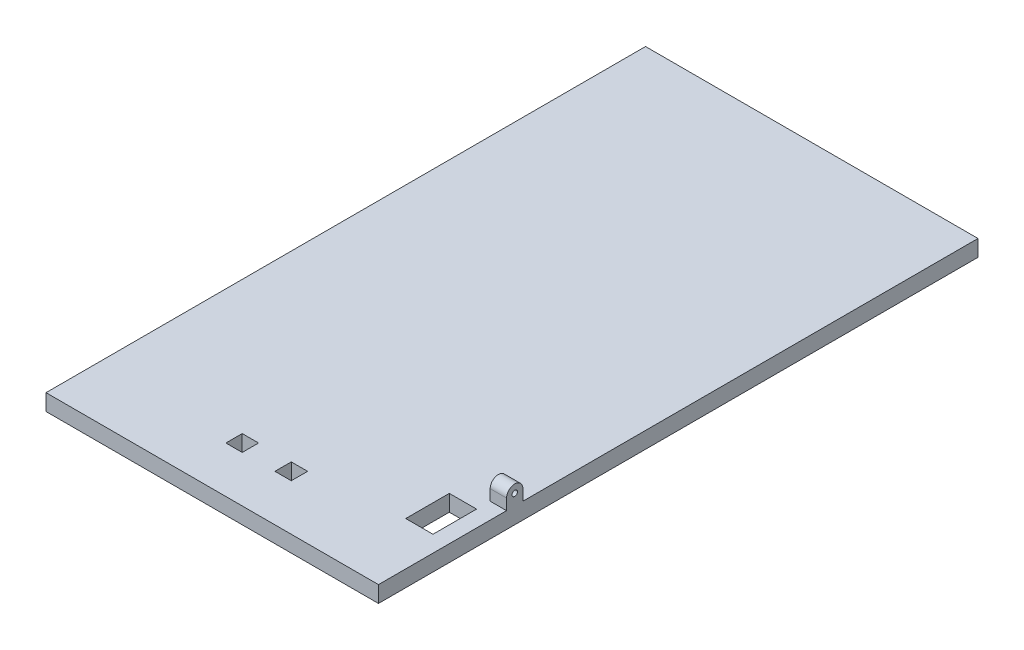
ISO-10303-21;
HEADER;
FILE_DESCRIPTION(('STEP AP214'),'2;1');
FILE_NAME('part.step','',(''),(''),'','','');
FILE_SCHEMA(('AUTOMOTIVE_DESIGN { 1 0 10303 214 1 1 1 1 }'));
ENDSEC;
DATA;
#1=APPLICATION_CONTEXT('core data for automotive mechanical design processes');
#2=APPLICATION_PROTOCOL_DEFINITION('international standard','automotive_design',2000,#1);
#3=PRODUCT_CONTEXT('',#1,'mechanical');
#4=PRODUCT('Part','Part','',(#3));
#5=PRODUCT_RELATED_PRODUCT_CATEGORY('part','',(#4));
#6=PRODUCT_DEFINITION_FORMATION('','',#4);
#7=PRODUCT_DEFINITION_CONTEXT('part definition',#1,'design');
#8=PRODUCT_DEFINITION('design','',#6,#7);
#9=PRODUCT_DEFINITION_SHAPE('','',#8);
#10=(LENGTH_UNIT() NAMED_UNIT(*) SI_UNIT(.MILLI.,.METRE.));
#11=(NAMED_UNIT(*) PLANE_ANGLE_UNIT() SI_UNIT($,.RADIAN.));
#12=(NAMED_UNIT(*) SI_UNIT($,.STERADIAN.) SOLID_ANGLE_UNIT());
#13=UNCERTAINTY_MEASURE_WITH_UNIT(LENGTH_MEASURE(1.E-05),#10,'distance_accuracy_value','');
#14=(GEOMETRIC_REPRESENTATION_CONTEXT(3) GLOBAL_UNCERTAINTY_ASSIGNED_CONTEXT((#13)) GLOBAL_UNIT_ASSIGNED_CONTEXT((#10,
#11,#12)) REPRESENTATION_CONTEXT('',''));
#15=CARTESIAN_POINT('',(0.,0.,0.));
#16=DIRECTION('',(0.,0.,1.));
#17=DIRECTION('',(1.,0.,0.));
#18=AXIS2_PLACEMENT_3D('',#15,#16,#17);
#19=CARTESIAN_POINT('',(0.,3.,0.));
#20=DIRECTION('',(0.,-1.,0.));
#21=DIRECTION('',(0.,0.,-1.));
#22=AXIS2_PLACEMENT_3D('',#19,#20,#21);
#23=PLANE('',#22);
#24=DIRECTION('',(0.,0.,1.));
#25=VECTOR('',#24,1.);
#26=CARTESIAN_POINT('',(27.5,3.,1.5));
#27=LINE('',#26,#25);
#28=CARTESIAN_POINT('',(27.5,3.,-1.5));
#29=VERTEX_POINT('',#28);
#30=CARTESIAN_POINT('',(27.5,3.,1.5));
#31=VERTEX_POINT('',#30);
#32=EDGE_CURVE('E198',#29,#31,#27,.T.);
#33=ORIENTED_EDGE('',*,*,#32,.T.);
#34=DIRECTION('',(-1.,0.,0.));
#35=VECTOR('',#34,1.);
#36=CARTESIAN_POINT('',(24.5,3.,1.5));
#37=LINE('',#36,#35);
#38=CARTESIAN_POINT('',(24.5,3.,1.5));
#39=VERTEX_POINT('',#38);
#40=EDGE_CURVE('E190',#31,#39,#37,.T.);
#41=ORIENTED_EDGE('',*,*,#40,.T.);
#42=DIRECTION('',(0.,0.,-1.));
#43=VECTOR('',#42,1.);
#44=CARTESIAN_POINT('',(24.5,3.,1.5));
#45=LINE('',#44,#43);
#46=CARTESIAN_POINT('',(24.5,3.,-1.5));
#47=VERTEX_POINT('',#46);
#48=EDGE_CURVE('E201',#39,#47,#45,.T.);
#49=ORIENTED_EDGE('',*,*,#48,.T.);
#50=DIRECTION('',(1.,0.,0.));
#51=VECTOR('',#50,1.);
#52=CARTESIAN_POINT('',(24.5,3.,-1.5));
#53=LINE('',#52,#51);
#54=EDGE_CURVE('E52',#47,#29,#53,.T.);
#55=ORIENTED_EDGE('',*,*,#54,.T.);
#56=EDGE_LOOP('',(#33,#41,#49,#55));
#57=FACE_BOUND('',#56,.T.);
#58=DIRECTION('',(1.,0.,0.));
#59=VECTOR('',#58,1.);
#60=CARTESIAN_POINT('',(36.5,3.,-1.5));
#61=LINE('',#60,#59);
#62=CARTESIAN_POINT('',(33.5,3.,-1.5));
#63=VERTEX_POINT('',#62);
#64=CARTESIAN_POINT('',(36.5,3.,-1.5));
#65=VERTEX_POINT('',#64);
#66=EDGE_CURVE('E232',#63,#65,#61,.T.);
#67=ORIENTED_EDGE('',*,*,#66,.T.);
#68=DIRECTION('',(0.,0.,1.));
#69=VECTOR('',#68,1.);
#70=CARTESIAN_POINT('',(36.5,3.,1.5));
#71=LINE('',#70,#69);
#72=CARTESIAN_POINT('',(36.5,3.,1.5));
#73=VERTEX_POINT('',#72);
#74=EDGE_CURVE('E224',#65,#73,#71,.T.);
#75=ORIENTED_EDGE('',*,*,#74,.T.);
#76=DIRECTION('',(-1.,0.,0.));
#77=VECTOR('',#76,1.);
#78=CARTESIAN_POINT('',(36.5,3.,1.5));
#79=LINE('',#78,#77);
#80=CARTESIAN_POINT('',(33.5,3.,1.5));
#81=VERTEX_POINT('',#80);
#82=EDGE_CURVE('E227',#73,#81,#79,.T.);
#83=ORIENTED_EDGE('',*,*,#82,.T.);
#84=DIRECTION('',(0.,0.,-1.));
#85=VECTOR('',#84,1.);
#86=CARTESIAN_POINT('',(33.5,3.,1.5));
#87=LINE('',#86,#85);
#88=EDGE_CURVE('E60',#81,#63,#87,.T.);
#89=ORIENTED_EDGE('',*,*,#88,.T.);
#90=EDGE_LOOP('',(#67,#75,#83,#89));
#91=FACE_BOUND('',#90,.T.);
#92=DIRECTION('',(-1.,0.,0.));
#93=VECTOR('',#92,1.);
#94=CARTESIAN_POINT('',(58.,3.,-11.));
#95=LINE('',#94,#93);
#96=CARTESIAN_POINT('',(58.,3.,-11.));
#97=VERTEX_POINT('',#96);
#98=CARTESIAN_POINT('',(53.,3.,-11.));
#99=VERTEX_POINT('',#98);
#100=EDGE_CURVE('E597',#97,#99,#95,.T.);
#101=ORIENTED_EDGE('',*,*,#100,.F.);
#102=DIRECTION('',(0.,0.,-1.));
#103=VECTOR('',#102,1.);
#104=CARTESIAN_POINT('',(58.,3.,-3.));
#105=LINE('',#104,#103);
#106=CARTESIAN_POINT('',(58.,3.,-3.));
#107=VERTEX_POINT('',#106);
#108=EDGE_CURVE('E595',#107,#97,#105,.T.);
#109=ORIENTED_EDGE('',*,*,#108,.F.);
#110=DIRECTION('',(1.,0.,0.));
#111=VECTOR('',#110,1.);
#112=CARTESIAN_POINT('',(58.,3.,-3.));
#113=LINE('',#112,#111);
#114=CARTESIAN_POINT('',(53.,3.,-3.));
#115=VERTEX_POINT('',#114);
#116=EDGE_CURVE('E606',#115,#107,#113,.T.);
#117=ORIENTED_EDGE('',*,*,#116,.F.);
#118=DIRECTION('',(0.,0.,1.));
#119=VECTOR('',#118,1.);
#120=CARTESIAN_POINT('',(53.,3.,-3.));
#121=LINE('',#120,#119);
#122=EDGE_CURVE('E603',#99,#115,#121,.T.);
#123=ORIENTED_EDGE('',*,*,#122,.F.);
#124=EDGE_LOOP('',(#101,#109,#117,#123));
#125=FACE_BOUND('',#124,.T.);
#126=DIRECTION('',(1.,0.,0.));
#127=VECTOR('',#126,1.);
#128=CARTESIAN_POINT('',(58.,3.,-13.5));
#129=LINE('',#128,#127);
#130=CARTESIAN_POINT('',(58.,3.,-13.5));
#131=VERTEX_POINT('',#130);
#132=CARTESIAN_POINT('',(61.,3.,-13.5));
#133=VERTEX_POINT('',#132);
#134=EDGE_CURVE('E270',#131,#133,#129,.T.);
#135=ORIENTED_EDGE('',*,*,#134,.F.);
#136=DIRECTION('',(0.,0.,-1.));
#137=VECTOR('',#136,1.);
#138=CARTESIAN_POINT('',(58.,3.,-13.5));
#139=LINE('',#138,#137);
#140=CARTESIAN_POINT('',(58.,3.,-16.5));
#141=VERTEX_POINT('',#140);
#142=EDGE_CURVE('E260',#131,#141,#139,.T.);
#143=ORIENTED_EDGE('',*,*,#142,.T.);
#144=DIRECTION('',(1.,0.,0.));
#145=VECTOR('',#144,1.);
#146=CARTESIAN_POINT('',(58.,3.,-16.5));
#147=LINE('',#146,#145);
#148=CARTESIAN_POINT('',(61.,3.,-16.5));
#149=VERTEX_POINT('',#148);
#150=EDGE_CURVE('E279',#141,#149,#147,.T.);
#151=ORIENTED_EDGE('',*,*,#150,.T.);
#152=DIRECTION('',(0.,0.,-1.));
#153=VECTOR('',#152,1.);
#154=CARTESIAN_POINT('',(61.,3.,0.));
#155=LINE('',#154,#153);
#156=CARTESIAN_POINT('',(61.,3.,-100.));
#157=VERTEX_POINT('',#156);
#158=EDGE_CURVE('E299',#149,#157,#155,.T.);
#159=ORIENTED_EDGE('',*,*,#158,.T.);
#160=DIRECTION('',(-1.,0.,0.));
#161=VECTOR('',#160,1.);
#162=CARTESIAN_POINT('',(0.,3.,-100.));
#163=LINE('',#162,#161);
#164=CARTESIAN_POINT('',(0.,3.,-100.));
#165=VERTEX_POINT('',#164);
#166=EDGE_CURVE('E308',#157,#165,#163,.T.);
#167=ORIENTED_EDGE('',*,*,#166,.T.);
#168=DIRECTION('',(0.,0.,1.));
#169=VECTOR('',#168,1.);
#170=CARTESIAN_POINT('',(0.,3.,0.));
#171=LINE('',#170,#169);
#172=CARTESIAN_POINT('',(0.,3.,10.));
#173=VERTEX_POINT('',#172);
#174=EDGE_CURVE('E303',#165,#173,#171,.T.);
#175=ORIENTED_EDGE('',*,*,#174,.T.);
#176=DIRECTION('',(-1.,0.,0.));
#177=VECTOR('',#176,1.);
#178=CARTESIAN_POINT('',(0.,3.,10.));
#179=LINE('',#178,#177);
#180=CARTESIAN_POINT('',(61.,3.,10.));
#181=VERTEX_POINT('',#180);
#182=EDGE_CURVE('E348',#181,#173,#179,.T.);
#183=ORIENTED_EDGE('',*,*,#182,.F.);
#184=EDGE_CURVE('E302',#181,#133,#155,.T.);
#185=ORIENTED_EDGE('',*,*,#184,.T.);
#186=EDGE_LOOP('',(#135,#143,#151,#159,#167,#175,#183,#185));
#187=FACE_BOUND('',#186,.T.);
#188=ADVANCED_FACE('F35',(#57,#91,#125,#187),#23,.F.);
#189=CARTESIAN_POINT('',(21.5,0.,0.));
#190=DIRECTION('',(1.,0.,0.));
#191=DIRECTION('',(0.,0.,-1.));
#192=AXIS2_PLACEMENT_3D('',#189,#190,#191);
#193=CYLINDRICAL_SURFACE('',#192,1.5);
#194=CARTESIAN_POINT('',(24.5,0.,0.));
#195=DIRECTION('',(1.,0.,0.));
#196=DIRECTION('',(0.,0.,-1.));
#197=AXIS2_PLACEMENT_3D('',#194,#195,#196);
#198=CIRCLE('',#197,1.5);
#199=CARTESIAN_POINT('',(24.5,0.,1.5));
#200=VERTEX_POINT('',#199);
#201=CARTESIAN_POINT('',(24.5,0.,-1.5));
#202=VERTEX_POINT('',#201);
#203=EDGE_CURVE('E354',#200,#202,#198,.T.);
#204=ORIENTED_EDGE('',*,*,#203,.F.);
#205=DIRECTION('',(1.,0.,0.));
#206=VECTOR('',#205,1.);
#207=CARTESIAN_POINT('',(21.5,0.,1.5));
#208=LINE('',#207,#206);
#209=CARTESIAN_POINT('',(21.5,0.,1.5));
#210=VERTEX_POINT('',#209);
#211=EDGE_CURVE('E347',#200,#210,#208,.F.);
#212=ORIENTED_EDGE('',*,*,#211,.T.);
#213=CARTESIAN_POINT('',(21.5,0.,0.));
#214=DIRECTION('',(1.,0.,0.));
#215=DIRECTION('',(0.,0.,-1.));
#216=AXIS2_PLACEMENT_3D('',#213,#214,#215);
#217=CIRCLE('',#216,1.5);
#218=CARTESIAN_POINT('',(21.5,0.,-1.5));
#219=VERTEX_POINT('',#218);
#220=EDGE_CURVE('E315',#210,#219,#217,.T.);
#221=ORIENTED_EDGE('',*,*,#220,.T.);
#222=DIRECTION('',(1.,0.,0.));
#223=VECTOR('',#222,1.);
#224=CARTESIAN_POINT('',(21.5,0.,-1.5));
#225=LINE('',#224,#223);
#226=EDGE_CURVE('E324',#219,#202,#225,.T.);
#227=ORIENTED_EDGE('',*,*,#226,.T.);
#228=EDGE_LOOP('',(#204,#212,#221,#227));
#229=FACE_BOUND('',#228,.T.);
#230=ADVANCED_FACE('F363',(#229),#193,.T.);
#231=CARTESIAN_POINT('',(21.5,0.,0.));
#232=DIRECTION('',(1.,0.,0.));
#233=DIRECTION('',(0.,0.,-1.));
#234=AXIS2_PLACEMENT_3D('',#231,#232,#233);
#235=PLANE('',#234);
#236=ORIENTED_EDGE('',*,*,#220,.F.);
#237=DIRECTION('',(0.,0.,1.));
#238=VECTOR('',#237,1.);
#239=CARTESIAN_POINT('',(21.5,0.,0.));
#240=LINE('',#239,#238);
#241=EDGE_CURVE('E327',#219,#210,#240,.T.);
#242=ORIENTED_EDGE('',*,*,#241,.F.);
#243=EDGE_LOOP('',(#236,#242));
#244=FACE_BOUND('',#243,.T.);
#245=ADVANCED_FACE('F370',(#244),#235,.F.);
#246=CARTESIAN_POINT('',(24.5,0.,0.));
#247=DIRECTION('',(1.,0.,0.));
#248=DIRECTION('',(0.,0.,-1.));
#249=AXIS2_PLACEMENT_3D('',#246,#247,#248);
#250=PLANE('',#249);
#251=ORIENTED_EDGE('',*,*,#203,.T.);
#252=DIRECTION('',(0.,-1.,0.));
#253=VECTOR('',#252,1.);
#254=CARTESIAN_POINT('',(24.5,3.,-1.5));
#255=LINE('',#254,#253);
#256=EDGE_CURVE('E197',#47,#202,#255,.T.);
#257=ORIENTED_EDGE('',*,*,#256,.F.);
#258=ORIENTED_EDGE('',*,*,#48,.F.);
#259=DIRECTION('',(0.,-1.,0.));
#260=VECTOR('',#259,1.);
#261=CARTESIAN_POINT('',(24.5,3.,1.5));
#262=LINE('',#261,#260);
#263=EDGE_CURVE('E186',#39,#200,#262,.T.);
#264=ORIENTED_EDGE('',*,*,#263,.T.);
#265=EDGE_LOOP('',(#251,#257,#258,#264));
#266=FACE_BOUND('',#265,.T.);
#267=ADVANCED_FACE('F202',(#266),#250,.T.);
#268=CARTESIAN_POINT('',(36.5,0.,0.));
#269=DIRECTION('',(1.,0.,0.));
#270=DIRECTION('',(0.,0.,-1.));
#271=AXIS2_PLACEMENT_3D('',#268,#269,#270);
#272=CYLINDRICAL_SURFACE('',#271,1.5);
#273=CARTESIAN_POINT('',(39.5,0.,0.));
#274=DIRECTION('',(1.,0.,0.));
#275=DIRECTION('',(0.,0.,-1.));
#276=AXIS2_PLACEMENT_3D('',#273,#274,#275);
#277=CIRCLE('',#276,1.5);
#278=CARTESIAN_POINT('',(39.5,0.,1.5));
#279=VERTEX_POINT('',#278);
#280=CARTESIAN_POINT('',(39.5,0.,-1.5));
#281=VERTEX_POINT('',#280);
#282=EDGE_CURVE('E334',#279,#281,#277,.T.);
#283=ORIENTED_EDGE('',*,*,#282,.F.);
#284=DIRECTION('',(1.,0.,0.));
#285=VECTOR('',#284,1.);
#286=CARTESIAN_POINT('',(36.5,0.,1.5));
#287=LINE('',#286,#285);
#288=CARTESIAN_POINT('',(36.5,0.,1.5));
#289=VERTEX_POINT('',#288);
#290=EDGE_CURVE('E339',#279,#289,#287,.F.);
#291=ORIENTED_EDGE('',*,*,#290,.T.);
#292=CARTESIAN_POINT('',(36.5,0.,0.));
#293=DIRECTION('',(1.,0.,0.));
#294=DIRECTION('',(0.,0.,-1.));
#295=AXIS2_PLACEMENT_3D('',#292,#293,#294);
#296=CIRCLE('',#295,1.5);
#297=CARTESIAN_POINT('',(36.5,0.,-1.5));
#298=VERTEX_POINT('',#297);
#299=EDGE_CURVE('E351',#289,#298,#296,.T.);
#300=ORIENTED_EDGE('',*,*,#299,.T.);
#301=DIRECTION('',(1.,0.,0.));
#302=VECTOR('',#301,1.);
#303=CARTESIAN_POINT('',(36.5,0.,-1.5));
#304=LINE('',#303,#302);
#305=EDGE_CURVE('E11',#298,#281,#304,.T.);
#306=ORIENTED_EDGE('',*,*,#305,.T.);
#307=EDGE_LOOP('',(#283,#291,#300,#306));
#308=FACE_BOUND('',#307,.T.);
#309=ADVANCED_FACE('F350',(#308),#272,.T.);
#310=CARTESIAN_POINT('',(36.5,0.,0.));
#311=DIRECTION('',(1.,0.,0.));
#312=DIRECTION('',(0.,0.,-1.));
#313=AXIS2_PLACEMENT_3D('',#310,#311,#312);
#314=PLANE('',#313);
#315=ORIENTED_EDGE('',*,*,#299,.F.);
#316=DIRECTION('',(0.,-1.,0.));
#317=VECTOR('',#316,1.);
#318=CARTESIAN_POINT('',(36.5,3.,1.5));
#319=LINE('',#318,#317);
#320=EDGE_CURVE('E235',#73,#289,#319,.T.);
#321=ORIENTED_EDGE('',*,*,#320,.F.);
#322=ORIENTED_EDGE('',*,*,#74,.F.);
#323=DIRECTION('',(0.,-1.,0.));
#324=VECTOR('',#323,1.);
#325=CARTESIAN_POINT('',(36.5,3.,-1.5));
#326=LINE('',#325,#324);
#327=EDGE_CURVE('E243',#65,#298,#326,.T.);
#328=ORIENTED_EDGE('',*,*,#327,.T.);
#329=EDGE_LOOP('',(#315,#321,#322,#328));
#330=FACE_BOUND('',#329,.T.);
#331=ADVANCED_FACE('F453',(#330),#314,.F.);
#332=CARTESIAN_POINT('',(39.5,0.,0.));
#333=DIRECTION('',(1.,0.,0.));
#334=DIRECTION('',(0.,0.,-1.));
#335=AXIS2_PLACEMENT_3D('',#332,#333,#334);
#336=PLANE('',#335);
#337=DIRECTION('',(0.,0.,1.));
#338=VECTOR('',#337,1.);
#339=CARTESIAN_POINT('',(39.5,0.,0.));
#340=LINE('',#339,#338);
#341=EDGE_CURVE('E44',#281,#279,#340,.T.);
#342=ORIENTED_EDGE('',*,*,#341,.T.);
#343=ORIENTED_EDGE('',*,*,#282,.T.);
#344=EDGE_LOOP('',(#342,#343));
#345=FACE_BOUND('',#344,.T.);
#346=ADVANCED_FACE('F332',(#345),#336,.T.);
#347=CARTESIAN_POINT('',(0.,0.,0.));
#348=DIRECTION('',(0.,-1.,0.));
#349=DIRECTION('',(0.,0.,-1.));
#350=AXIS2_PLACEMENT_3D('',#347,#348,#349);
#351=PLANE('',#350);
#352=DIRECTION('',(-1.,0.,0.));
#353=VECTOR('',#352,1.);
#354=CARTESIAN_POINT('',(24.5,0.,1.5));
#355=LINE('',#354,#353);
#356=CARTESIAN_POINT('',(27.5,0.,1.5));
#357=VERTEX_POINT('',#356);
#358=EDGE_CURVE('E193',#357,#200,#355,.T.);
#359=ORIENTED_EDGE('',*,*,#358,.F.);
#360=DIRECTION('',(0.,0.,1.));
#361=VECTOR('',#360,1.);
#362=CARTESIAN_POINT('',(27.5,0.,1.5));
#363=LINE('',#362,#361);
#364=CARTESIAN_POINT('',(27.5,0.,-1.5));
#365=VERTEX_POINT('',#364);
#366=EDGE_CURVE('E207',#365,#357,#363,.T.);
#367=ORIENTED_EDGE('',*,*,#366,.F.);
#368=DIRECTION('',(1.,0.,0.));
#369=VECTOR('',#368,1.);
#370=CARTESIAN_POINT('',(24.5,0.,-1.5));
#371=LINE('',#370,#369);
#372=EDGE_CURVE('E210',#202,#365,#371,.T.);
#373=ORIENTED_EDGE('',*,*,#372,.F.);
#374=ORIENTED_EDGE('',*,*,#226,.F.);
#375=ORIENTED_EDGE('',*,*,#241,.T.);
#376=ORIENTED_EDGE('',*,*,#211,.F.);
#377=EDGE_LOOP('',(#359,#367,#373,#374,#375,#376));
#378=FACE_BOUND('',#377,.T.);
#379=DIRECTION('',(1.,0.,0.));
#380=VECTOR('',#379,1.);
#381=CARTESIAN_POINT('',(36.5,0.,-1.5));
#382=LINE('',#381,#380);
#383=CARTESIAN_POINT('',(33.5,0.,-1.5));
#384=VERTEX_POINT('',#383);
#385=EDGE_CURVE('E228',#384,#298,#382,.T.);
#386=ORIENTED_EDGE('',*,*,#385,.F.);
#387=DIRECTION('',(0.,0.,-1.));
#388=VECTOR('',#387,1.);
#389=CARTESIAN_POINT('',(33.5,0.,1.5));
#390=LINE('',#389,#388);
#391=CARTESIAN_POINT('',(33.5,0.,1.5));
#392=VERTEX_POINT('',#391);
#393=EDGE_CURVE('E238',#392,#384,#390,.T.);
#394=ORIENTED_EDGE('',*,*,#393,.F.);
#395=DIRECTION('',(-1.,0.,0.));
#396=VECTOR('',#395,1.);
#397=CARTESIAN_POINT('',(36.5,0.,1.5));
#398=LINE('',#397,#396);
#399=EDGE_CURVE('E220',#289,#392,#398,.T.);
#400=ORIENTED_EDGE('',*,*,#399,.F.);
#401=ORIENTED_EDGE('',*,*,#290,.F.);
#402=ORIENTED_EDGE('',*,*,#341,.F.);
#403=ORIENTED_EDGE('',*,*,#305,.F.);
#404=EDGE_LOOP('',(#386,#394,#400,#401,#402,#403));
#405=FACE_BOUND('',#404,.T.);
#406=DIRECTION('',(0.,0.,1.));
#407=VECTOR('',#406,1.);
#408=CARTESIAN_POINT('',(58.,0.,0.));
#409=LINE('',#408,#407);
#410=CARTESIAN_POINT('',(58.,0.,-11.));
#411=VERTEX_POINT('',#410);
#412=CARTESIAN_POINT('',(58.,0.,-3.));
#413=VERTEX_POINT('',#412);
#414=EDGE_CURVE('E352',#411,#413,#409,.T.);
#415=ORIENTED_EDGE('',*,*,#414,.F.);
#416=DIRECTION('',(1.,0.,0.));
#417=VECTOR('',#416,1.);
#418=CARTESIAN_POINT('',(0.,0.,-11.));
#419=LINE('',#418,#417);
#420=CARTESIAN_POINT('',(53.,0.,-11.));
#421=VERTEX_POINT('',#420);
#422=EDGE_CURVE('E612',#421,#411,#419,.T.);
#423=ORIENTED_EDGE('',*,*,#422,.F.);
#424=DIRECTION('',(0.,0.,-1.));
#425=VECTOR('',#424,1.);
#426=CARTESIAN_POINT('',(53.,0.,0.));
#427=LINE('',#426,#425);
#428=CARTESIAN_POINT('',(53.,0.,-3.));
#429=VERTEX_POINT('',#428);
#430=EDGE_CURVE('E620',#429,#421,#427,.T.);
#431=ORIENTED_EDGE('',*,*,#430,.F.);
#432=DIRECTION('',(-1.,0.,0.));
#433=VECTOR('',#432,1.);
#434=CARTESIAN_POINT('',(0.,0.,-3.));
#435=LINE('',#434,#433);
#436=EDGE_CURVE('E356',#413,#429,#435,.T.);
#437=ORIENTED_EDGE('',*,*,#436,.F.);
#438=EDGE_LOOP('',(#415,#423,#431,#437));
#439=FACE_BOUND('',#438,.T.);
#440=DIRECTION('',(1.,0.,0.));
#441=VECTOR('',#440,1.);
#442=CARTESIAN_POINT('',(0.,0.,10.));
#443=LINE('',#442,#441);
#444=CARTESIAN_POINT('',(0.,0.,10.));
#445=VERTEX_POINT('',#444);
#446=CARTESIAN_POINT('',(61.,0.,10.));
#447=VERTEX_POINT('',#446);
#448=EDGE_CURVE('E655',#445,#447,#443,.T.);
#449=ORIENTED_EDGE('',*,*,#448,.F.);
#450=DIRECTION('',(0.,0.,1.));
#451=VECTOR('',#450,1.);
#452=CARTESIAN_POINT('',(0.,0.,0.));
#453=LINE('',#452,#451);
#454=CARTESIAN_POINT('',(0.,0.,-100.));
#455=VERTEX_POINT('',#454);
#456=EDGE_CURVE('E312',#455,#445,#453,.T.);
#457=ORIENTED_EDGE('',*,*,#456,.F.);
#458=DIRECTION('',(-1.,0.,0.));
#459=VECTOR('',#458,1.);
#460=CARTESIAN_POINT('',(0.,0.,-100.));
#461=LINE('',#460,#459);
#462=CARTESIAN_POINT('',(61.,0.,-100.));
#463=VERTEX_POINT('',#462);
#464=EDGE_CURVE('E317',#463,#455,#461,.T.);
#465=ORIENTED_EDGE('',*,*,#464,.F.);
#466=DIRECTION('',(0.,0.,-1.));
#467=VECTOR('',#466,1.);
#468=CARTESIAN_POINT('',(61.,0.,0.));
#469=LINE('',#468,#467);
#470=EDGE_CURVE('E314',#447,#463,#469,.T.);
#471=ORIENTED_EDGE('',*,*,#470,.F.);
#472=EDGE_LOOP('',(#449,#457,#465,#471));
#473=FACE_BOUND('',#472,.T.);
#474=ADVANCED_FACE('F341',(#378,#405,#439,#473),#351,.T.);
#475=CARTESIAN_POINT('',(0.,3.,0.));
#476=DIRECTION('',(1.,0.,0.));
#477=DIRECTION('',(0.,0.,-1.));
#478=AXIS2_PLACEMENT_3D('',#475,#476,#477);
#479=PLANE('',#478);
#480=ORIENTED_EDGE('',*,*,#456,.T.);
#481=DIRECTION('',(0.,-1.,0.));
#482=VECTOR('',#481,1.);
#483=CARTESIAN_POINT('',(0.,0.,10.));
#484=LINE('',#483,#482);
#485=EDGE_CURVE('E276',#173,#445,#484,.T.);
#486=ORIENTED_EDGE('',*,*,#485,.F.);
#487=ORIENTED_EDGE('',*,*,#174,.F.);
#488=DIRECTION('',(0.,-1.,0.));
#489=VECTOR('',#488,1.);
#490=CARTESIAN_POINT('',(0.,3.,-100.));
#491=LINE('',#490,#489);
#492=EDGE_CURVE('E311',#165,#455,#491,.T.);
#493=ORIENTED_EDGE('',*,*,#492,.T.);
#494=EDGE_LOOP('',(#480,#486,#487,#493));
#495=FACE_BOUND('',#494,.T.);
#496=ADVANCED_FACE('F37',(#495),#479,.F.);
#497=CARTESIAN_POINT('',(61.,3.,0.));
#498=DIRECTION('',(-1.,0.,0.));
#499=DIRECTION('',(0.,0.,1.));
#500=AXIS2_PLACEMENT_3D('',#497,#498,#499);
#501=PLANE('',#500);
#502=ORIENTED_EDGE('',*,*,#470,.T.);
#503=DIRECTION('',(0.,-1.,0.));
#504=VECTOR('',#503,1.);
#505=CARTESIAN_POINT('',(61.,3.,-100.));
#506=LINE('',#505,#504);
#507=EDGE_CURVE('E321',#157,#463,#506,.T.);
#508=ORIENTED_EDGE('',*,*,#507,.F.);
#509=ORIENTED_EDGE('',*,*,#158,.F.);
#510=DIRECTION('',(0.,1.,0.));
#511=VECTOR('',#510,1.);
#512=CARTESIAN_POINT('',(61.,3.,-16.5));
#513=LINE('',#512,#511);
#514=CARTESIAN_POINT('',(61.,5.,-16.5));
#515=VERTEX_POINT('',#514);
#516=EDGE_CURVE('E273',#149,#515,#513,.T.);
#517=ORIENTED_EDGE('',*,*,#516,.T.);
#518=CARTESIAN_POINT('',(61.,5.,-15.));
#519=DIRECTION('',(1.,0.,0.));
#520=DIRECTION('',(0.,0.,1.));
#521=AXIS2_PLACEMENT_3D('',#518,#519,#520);
#522=CIRCLE('',#521,1.5);
#523=CARTESIAN_POINT('',(61.,5.,-13.5));
#524=VERTEX_POINT('',#523);
#525=EDGE_CURVE('E261',#515,#524,#522,.T.);
#526=ORIENTED_EDGE('',*,*,#525,.T.);
#527=DIRECTION('',(0.,-1.,0.));
#528=VECTOR('',#527,1.);
#529=CARTESIAN_POINT('',(61.,3.,-13.5));
#530=LINE('',#529,#528);
#531=EDGE_CURVE('E254',#524,#133,#530,.T.);
#532=ORIENTED_EDGE('',*,*,#531,.T.);
#533=ORIENTED_EDGE('',*,*,#184,.F.);
#534=DIRECTION('',(0.,1.,0.));
#535=VECTOR('',#534,1.);
#536=CARTESIAN_POINT('',(61.,0.,10.));
#537=LINE('',#536,#535);
#538=EDGE_CURVE('E652',#447,#181,#537,.T.);
#539=ORIENTED_EDGE('',*,*,#538,.F.);
#540=EDGE_LOOP('',(#502,#508,#509,#517,#526,#532,#533,#539));
#541=FACE_BOUND('',#540,.T.);
#542=CARTESIAN_POINT('',(61.,5.,-15.));
#543=DIRECTION('',(1.,0.,0.));
#544=DIRECTION('',(0.,0.,1.));
#545=AXIS2_PLACEMENT_3D('',#542,#543,#544);
#546=CIRCLE('',#545,0.500000000000001);
#547=CARTESIAN_POINT('',(61.,5.,-14.5));
#548=VERTEX_POINT('',#547);
#549=EDGE_CURVE('E245',#548,#548,#546,.T.);
#550=ORIENTED_EDGE('',*,*,#549,.F.);
#551=EDGE_LOOP('',(#550));
#552=FACE_BOUND('',#551,.T.);
#553=ADVANCED_FACE('F390',(#541,#552),#501,.F.);
#554=CARTESIAN_POINT('',(0.,3.,-100.));
#555=DIRECTION('',(0.,0.,1.));
#556=DIRECTION('',(1.,0.,0.));
#557=AXIS2_PLACEMENT_3D('',#554,#555,#556);
#558=PLANE('',#557);
#559=ORIENTED_EDGE('',*,*,#464,.T.);
#560=ORIENTED_EDGE('',*,*,#492,.F.);
#561=ORIENTED_EDGE('',*,*,#166,.F.);
#562=ORIENTED_EDGE('',*,*,#507,.T.);
#563=EDGE_LOOP('',(#559,#560,#561,#562));
#564=FACE_BOUND('',#563,.T.);
#565=ADVANCED_FACE('F387',(#564),#558,.F.);
#566=CARTESIAN_POINT('',(58.,-2.,-3.));
#567=DIRECTION('',(1.,0.,0.));
#568=DIRECTION('',(0.,0.,-1.));
#569=AXIS2_PLACEMENT_3D('',#566,#567,#568);
#570=PLANE('',#569);
#571=ORIENTED_EDGE('',*,*,#414,.T.);
#572=DIRECTION('',(0.,1.,0.));
#573=VECTOR('',#572,1.);
#574=CARTESIAN_POINT('',(58.,-2.,-3.));
#575=LINE('',#574,#573);
#576=EDGE_CURVE('E610',#413,#107,#575,.T.);
#577=ORIENTED_EDGE('',*,*,#576,.T.);
#578=ORIENTED_EDGE('',*,*,#108,.T.);
#579=DIRECTION('',(0.,1.,0.));
#580=VECTOR('',#579,1.);
#581=CARTESIAN_POINT('',(58.,-2.,-11.));
#582=LINE('',#581,#580);
#583=EDGE_CURVE('E609',#411,#97,#582,.T.);
#584=ORIENTED_EDGE('',*,*,#583,.F.);
#585=EDGE_LOOP('',(#571,#577,#578,#584));
#586=FACE_BOUND('',#585,.T.);
#587=ADVANCED_FACE('F389',(#586),#570,.F.);
#588=CARTESIAN_POINT('',(58.,-2.,-3.));
#589=DIRECTION('',(0.,0.,1.));
#590=DIRECTION('',(1.,0.,0.));
#591=AXIS2_PLACEMENT_3D('',#588,#589,#590);
#592=PLANE('',#591);
#593=ORIENTED_EDGE('',*,*,#436,.T.);
#594=DIRECTION('',(0.,1.,0.));
#595=VECTOR('',#594,1.);
#596=CARTESIAN_POINT('',(53.,-2.,-3.));
#597=LINE('',#596,#595);
#598=EDGE_CURVE('E613',#429,#115,#597,.T.);
#599=ORIENTED_EDGE('',*,*,#598,.T.);
#600=ORIENTED_EDGE('',*,*,#116,.T.);
#601=ORIENTED_EDGE('',*,*,#576,.F.);
#602=EDGE_LOOP('',(#593,#599,#600,#601));
#603=FACE_BOUND('',#602,.T.);
#604=ADVANCED_FACE('F439',(#603),#592,.F.);
#605=CARTESIAN_POINT('',(53.,-2.,-3.));
#606=DIRECTION('',(-1.,0.,0.));
#607=DIRECTION('',(0.,0.,1.));
#608=AXIS2_PLACEMENT_3D('',#605,#606,#607);
#609=PLANE('',#608);
#610=ORIENTED_EDGE('',*,*,#430,.T.);
#611=DIRECTION('',(0.,1.,0.));
#612=VECTOR('',#611,1.);
#613=CARTESIAN_POINT('',(53.,-2.,-11.));
#614=LINE('',#613,#612);
#615=EDGE_CURVE('E615',#421,#99,#614,.T.);
#616=ORIENTED_EDGE('',*,*,#615,.T.);
#617=ORIENTED_EDGE('',*,*,#122,.T.);
#618=ORIENTED_EDGE('',*,*,#598,.F.);
#619=EDGE_LOOP('',(#610,#616,#617,#618));
#620=FACE_BOUND('',#619,.T.);
#621=ADVANCED_FACE('F442',(#620),#609,.F.);
#622=CARTESIAN_POINT('',(58.,-2.,-11.));
#623=DIRECTION('',(0.,0.,-1.));
#624=DIRECTION('',(-1.,0.,0.));
#625=AXIS2_PLACEMENT_3D('',#622,#623,#624);
#626=PLANE('',#625);
#627=ORIENTED_EDGE('',*,*,#422,.T.);
#628=ORIENTED_EDGE('',*,*,#583,.T.);
#629=ORIENTED_EDGE('',*,*,#100,.T.);
#630=ORIENTED_EDGE('',*,*,#615,.F.);
#631=EDGE_LOOP('',(#627,#628,#629,#630));
#632=FACE_BOUND('',#631,.T.);
#633=ADVANCED_FACE('F437',(#632),#626,.F.);
#634=CARTESIAN_POINT('',(0.,0.,10.));
#635=DIRECTION('',(0.,0.,-1.));
#636=DIRECTION('',(-1.,0.,0.));
#637=AXIS2_PLACEMENT_3D('',#634,#635,#636);
#638=PLANE('',#637);
#639=ORIENTED_EDGE('',*,*,#485,.T.);
#640=ORIENTED_EDGE('',*,*,#448,.T.);
#641=ORIENTED_EDGE('',*,*,#538,.T.);
#642=ORIENTED_EDGE('',*,*,#182,.T.);
#643=EDGE_LOOP('',(#639,#640,#641,#642));
#644=FACE_BOUND('',#643,.T.);
#645=ADVANCED_FACE('F433',(#644),#638,.F.);
#646=CARTESIAN_POINT('',(58.,3.,-13.5));
#647=DIRECTION('',(0.,0.,1.));
#648=DIRECTION('',(1.,0.,0.));
#649=AXIS2_PLACEMENT_3D('',#646,#647,#648);
#650=PLANE('',#649);
#651=ORIENTED_EDGE('',*,*,#531,.F.);
#652=DIRECTION('',(1.,0.,0.));
#653=VECTOR('',#652,1.);
#654=CARTESIAN_POINT('',(58.,5.,-13.5));
#655=LINE('',#654,#653);
#656=CARTESIAN_POINT('',(58.,5.,-13.5));
#657=VERTEX_POINT('',#656);
#658=EDGE_CURVE('E274',#657,#524,#655,.T.);
#659=ORIENTED_EDGE('',*,*,#658,.F.);
#660=DIRECTION('',(0.,-1.,0.));
#661=VECTOR('',#660,1.);
#662=CARTESIAN_POINT('',(58.,3.,-13.5));
#663=LINE('',#662,#661);
#664=EDGE_CURVE('E257',#657,#131,#663,.T.);
#665=ORIENTED_EDGE('',*,*,#664,.T.);
#666=ORIENTED_EDGE('',*,*,#134,.T.);
#667=EDGE_LOOP('',(#651,#659,#665,#666));
#668=FACE_BOUND('',#667,.T.);
#669=ADVANCED_FACE('F426',(#668),#650,.T.);
#670=CARTESIAN_POINT('',(58.,5.,-15.));
#671=DIRECTION('',(1.,0.,0.));
#672=DIRECTION('',(0.,0.,-1.));
#673=AXIS2_PLACEMENT_3D('',#670,#671,#672);
#674=CYLINDRICAL_SURFACE('',#673,1.5);
#675=ORIENTED_EDGE('',*,*,#525,.F.);
#676=DIRECTION('',(1.,0.,0.));
#677=VECTOR('',#676,1.);
#678=CARTESIAN_POINT('',(58.,5.,-16.5));
#679=LINE('',#678,#677);
#680=CARTESIAN_POINT('',(58.,5.,-16.5));
#681=VERTEX_POINT('',#680);
#682=EDGE_CURVE('E277',#681,#515,#679,.T.);
#683=ORIENTED_EDGE('',*,*,#682,.F.);
#684=CARTESIAN_POINT('',(58.,5.,-15.));
#685=DIRECTION('',(1.,0.,0.));
#686=DIRECTION('',(0.,0.,1.));
#687=AXIS2_PLACEMENT_3D('',#684,#685,#686);
#688=CIRCLE('',#687,1.5);
#689=EDGE_CURVE('E267',#681,#657,#688,.T.);
#690=ORIENTED_EDGE('',*,*,#689,.T.);
#691=ORIENTED_EDGE('',*,*,#658,.T.);
#692=EDGE_LOOP('',(#675,#683,#690,#691));
#693=FACE_BOUND('',#692,.T.);
#694=ADVANCED_FACE('F423',(#693),#674,.T.);
#695=CARTESIAN_POINT('',(58.,3.,-16.5));
#696=DIRECTION('',(0.,0.,-1.));
#697=DIRECTION('',(0.,1.,0.));
#698=AXIS2_PLACEMENT_3D('',#695,#696,#697);
#699=PLANE('',#698);
#700=ORIENTED_EDGE('',*,*,#516,.F.);
#701=ORIENTED_EDGE('',*,*,#150,.F.);
#702=DIRECTION('',(0.,1.,0.));
#703=VECTOR('',#702,1.);
#704=CARTESIAN_POINT('',(58.,3.,-16.5));
#705=LINE('',#704,#703);
#706=EDGE_CURVE('E264',#141,#681,#705,.T.);
#707=ORIENTED_EDGE('',*,*,#706,.T.);
#708=ORIENTED_EDGE('',*,*,#682,.T.);
#709=EDGE_LOOP('',(#700,#701,#707,#708));
#710=FACE_BOUND('',#709,.T.);
#711=ADVANCED_FACE('F415',(#710),#699,.T.);
#712=CARTESIAN_POINT('',(58.,5.,-15.));
#713=DIRECTION('',(-1.,0.,0.));
#714=DIRECTION('',(0.,0.,1.));
#715=AXIS2_PLACEMENT_3D('',#712,#713,#714);
#716=PLANE('',#715);
#717=CARTESIAN_POINT('',(58.,5.,-15.));
#718=DIRECTION('',(1.,0.,0.));
#719=DIRECTION('',(0.,0.,1.));
#720=AXIS2_PLACEMENT_3D('',#717,#718,#719);
#721=CIRCLE('',#720,0.500000000000001);
#722=CARTESIAN_POINT('',(58.,5.,-14.5));
#723=VERTEX_POINT('',#722);
#724=EDGE_CURVE('E251',#723,#723,#721,.T.);
#725=ORIENTED_EDGE('',*,*,#724,.T.);
#726=EDGE_LOOP('',(#725));
#727=FACE_BOUND('',#726,.T.);
#728=ORIENTED_EDGE('',*,*,#664,.F.);
#729=ORIENTED_EDGE('',*,*,#689,.F.);
#730=ORIENTED_EDGE('',*,*,#706,.F.);
#731=ORIENTED_EDGE('',*,*,#142,.F.);
#732=EDGE_LOOP('',(#728,#729,#730,#731));
#733=FACE_BOUND('',#732,.T.);
#734=ADVANCED_FACE('F405',(#727,#733),#716,.T.);
#735=CARTESIAN_POINT('',(58.,5.,-15.));
#736=DIRECTION('',(1.,0.,0.));
#737=DIRECTION('',(0.,0.,-1.));
#738=AXIS2_PLACEMENT_3D('',#735,#736,#737);
#739=CYLINDRICAL_SURFACE('',#738,0.500000000000001);
#740=ORIENTED_EDGE('',*,*,#724,.F.);
#741=EDGE_LOOP('',(#740));
#742=FACE_BOUND('',#741,.T.);
#743=ORIENTED_EDGE('',*,*,#549,.T.);
#744=EDGE_LOOP('',(#743));
#745=FACE_BOUND('',#744,.T.);
#746=ADVANCED_FACE('F402',(#742,#745),#739,.F.);
#747=CARTESIAN_POINT('',(36.5,3.,-1.5));
#748=DIRECTION('',(0.,0.,-1.));
#749=DIRECTION('',(-1.,0.,0.));
#750=AXIS2_PLACEMENT_3D('',#747,#748,#749);
#751=PLANE('',#750);
#752=ORIENTED_EDGE('',*,*,#385,.T.);
#753=ORIENTED_EDGE('',*,*,#327,.F.);
#754=ORIENTED_EDGE('',*,*,#66,.F.);
#755=DIRECTION('',(0.,-1.,0.));
#756=VECTOR('',#755,1.);
#757=CARTESIAN_POINT('',(33.5,3.,-1.5));
#758=LINE('',#757,#756);
#759=EDGE_CURVE('E246',#63,#384,#758,.T.);
#760=ORIENTED_EDGE('',*,*,#759,.T.);
#761=EDGE_LOOP('',(#752,#753,#754,#760));
#762=FACE_BOUND('',#761,.T.);
#763=ADVANCED_FACE('F404',(#762),#751,.F.);
#764=CARTESIAN_POINT('',(33.5,3.,1.5));
#765=DIRECTION('',(-1.,0.,0.));
#766=DIRECTION('',(0.,0.,1.));
#767=AXIS2_PLACEMENT_3D('',#764,#765,#766);
#768=PLANE('',#767);
#769=ORIENTED_EDGE('',*,*,#393,.T.);
#770=ORIENTED_EDGE('',*,*,#759,.F.);
#771=ORIENTED_EDGE('',*,*,#88,.F.);
#772=DIRECTION('',(0.,-1.,0.));
#773=VECTOR('',#772,1.);
#774=CARTESIAN_POINT('',(33.5,3.,1.5));
#775=LINE('',#774,#773);
#776=EDGE_CURVE('E248',#81,#392,#775,.T.);
#777=ORIENTED_EDGE('',*,*,#776,.T.);
#778=EDGE_LOOP('',(#769,#770,#771,#777));
#779=FACE_BOUND('',#778,.T.);
#780=ADVANCED_FACE('F412',(#779),#768,.F.);
#781=CARTESIAN_POINT('',(36.5,3.,1.5));
#782=DIRECTION('',(0.,0.,1.));
#783=DIRECTION('',(1.,0.,0.));
#784=AXIS2_PLACEMENT_3D('',#781,#782,#783);
#785=PLANE('',#784);
#786=ORIENTED_EDGE('',*,*,#399,.T.);
#787=ORIENTED_EDGE('',*,*,#776,.F.);
#788=ORIENTED_EDGE('',*,*,#82,.F.);
#789=ORIENTED_EDGE('',*,*,#320,.T.);
#790=EDGE_LOOP('',(#786,#787,#788,#789));
#791=FACE_BOUND('',#790,.T.);
#792=ADVANCED_FACE('F420',(#791),#785,.F.);
#793=CARTESIAN_POINT('',(24.5,3.,1.5));
#794=DIRECTION('',(0.,0.,1.));
#795=DIRECTION('',(1.,0.,0.));
#796=AXIS2_PLACEMENT_3D('',#793,#794,#795);
#797=PLANE('',#796);
#798=ORIENTED_EDGE('',*,*,#358,.T.);
#799=ORIENTED_EDGE('',*,*,#263,.F.);
#800=ORIENTED_EDGE('',*,*,#40,.F.);
#801=DIRECTION('',(0.,-1.,0.));
#802=VECTOR('',#801,1.);
#803=CARTESIAN_POINT('',(27.5,3.,1.5));
#804=LINE('',#803,#802);
#805=EDGE_CURVE('E218',#31,#357,#804,.T.);
#806=ORIENTED_EDGE('',*,*,#805,.T.);
#807=EDGE_LOOP('',(#798,#799,#800,#806));
#808=FACE_BOUND('',#807,.T.);
#809=ADVANCED_FACE('F188',(#808),#797,.F.);
#810=CARTESIAN_POINT('',(27.5,3.,1.5));
#811=DIRECTION('',(1.,0.,0.));
#812=DIRECTION('',(0.,0.,-1.));
#813=AXIS2_PLACEMENT_3D('',#810,#811,#812);
#814=PLANE('',#813);
#815=ORIENTED_EDGE('',*,*,#366,.T.);
#816=ORIENTED_EDGE('',*,*,#805,.F.);
#817=ORIENTED_EDGE('',*,*,#32,.F.);
#818=DIRECTION('',(0.,-1.,0.));
#819=VECTOR('',#818,1.);
#820=CARTESIAN_POINT('',(27.5,3.,-1.5));
#821=LINE('',#820,#819);
#822=EDGE_CURVE('E221',#29,#365,#821,.T.);
#823=ORIENTED_EDGE('',*,*,#822,.T.);
#824=EDGE_LOOP('',(#815,#816,#817,#823));
#825=FACE_BOUND('',#824,.T.);
#826=ADVANCED_FACE('F571',(#825),#814,.F.);
#827=CARTESIAN_POINT('',(24.5,3.,-1.5));
#828=DIRECTION('',(0.,0.,-1.));
#829=DIRECTION('',(-1.,0.,0.));
#830=AXIS2_PLACEMENT_3D('',#827,#828,#829);
#831=PLANE('',#830);
#832=ORIENTED_EDGE('',*,*,#372,.T.);
#833=ORIENTED_EDGE('',*,*,#822,.F.);
#834=ORIENTED_EDGE('',*,*,#54,.F.);
#835=ORIENTED_EDGE('',*,*,#256,.T.);
#836=EDGE_LOOP('',(#832,#833,#834,#835));
#837=FACE_BOUND('',#836,.T.);
#838=ADVANCED_FACE('F579',(#837),#831,.F.);
#839=CLOSED_SHELL('',(#188,#230,#245,#267,#309,#331,#346,#474,#496,#553,#565,#587,#604,#621,
#633,#645,#669,#694,#711,#734,#746,#763,#780,#792,#809,#826,#838));
#840=MANIFOLD_SOLID_BREP('B2',#839);
#841=ADVANCED_BREP_SHAPE_REPRESENTATION('',(#18,#840),#14);
#842=SHAPE_DEFINITION_REPRESENTATION(#9,#841);
ENDSEC;
END-ISO-10303-21;
